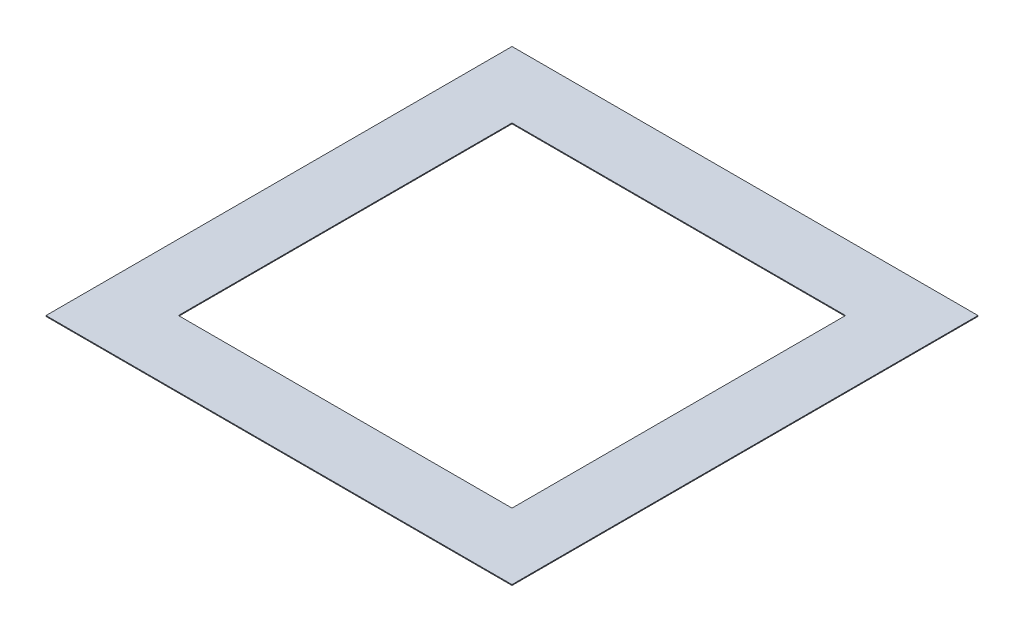
ISO-10303-21;
HEADER;
FILE_DESCRIPTION(('STEP AP214'),'2;1');
FILE_NAME('part.step','',(''),(''),'','','');
FILE_SCHEMA(('AUTOMOTIVE_DESIGN { 1 0 10303 214 1 1 1 1 }'));
ENDSEC;
DATA;
#1=APPLICATION_CONTEXT('core data for automotive mechanical design processes');
#2=APPLICATION_PROTOCOL_DEFINITION('international standard','automotive_design',2000,#1);
#3=PRODUCT_CONTEXT('',#1,'mechanical');
#4=PRODUCT('Part','Part','',(#3));
#5=PRODUCT_RELATED_PRODUCT_CATEGORY('part','',(#4));
#6=PRODUCT_DEFINITION_FORMATION('','',#4);
#7=PRODUCT_DEFINITION_CONTEXT('part definition',#1,'design');
#8=PRODUCT_DEFINITION('design','',#6,#7);
#9=PRODUCT_DEFINITION_SHAPE('','',#8);
#10=(LENGTH_UNIT() NAMED_UNIT(*) SI_UNIT(.MILLI.,.METRE.));
#11=(NAMED_UNIT(*) PLANE_ANGLE_UNIT() SI_UNIT($,.RADIAN.));
#12=(NAMED_UNIT(*) SI_UNIT($,.STERADIAN.) SOLID_ANGLE_UNIT());
#13=UNCERTAINTY_MEASURE_WITH_UNIT(LENGTH_MEASURE(1.E-05),#10,'distance_accuracy_value','');
#14=(GEOMETRIC_REPRESENTATION_CONTEXT(3) GLOBAL_UNCERTAINTY_ASSIGNED_CONTEXT((#13)) GLOBAL_UNIT_ASSIGNED_CONTEXT((#10,
#11,#12)) REPRESENTATION_CONTEXT('',''));
#15=CARTESIAN_POINT('',(0.,0.,0.));
#16=DIRECTION('',(0.,0.,1.));
#17=DIRECTION('',(1.,0.,0.));
#18=AXIS2_PLACEMENT_3D('',#15,#16,#17);
#19=CARTESIAN_POINT('',(0.,0.125,0.));
#20=DIRECTION('',(0.,-1.,0.));
#21=DIRECTION('',(0.,0.,-1.));
#22=AXIS2_PLACEMENT_3D('',#19,#20,#21);
#23=PLANE('',#22);
#24=DIRECTION('',(0.,0.,-1.));
#25=VECTOR('',#24,1.);
#26=CARTESIAN_POINT('',(69.85,0.125,69.85));
#27=LINE('',#26,#25);
#28=CARTESIAN_POINT('',(69.85,0.125,69.85));
#29=VERTEX_POINT('',#28);
#30=CARTESIAN_POINT('',(69.85,0.125,-69.85));
#31=VERTEX_POINT('',#30);
#32=EDGE_CURVE('E136',#29,#31,#27,.T.);
#33=ORIENTED_EDGE('',*,*,#32,.T.);
#34=DIRECTION('',(-1.,0.,0.));
#35=VECTOR('',#34,1.);
#36=CARTESIAN_POINT('',(-69.85,0.125,-69.85));
#37=LINE('',#36,#35);
#38=CARTESIAN_POINT('',(-69.85,0.125,-69.85));
#39=VERTEX_POINT('',#38);
#40=EDGE_CURVE('E139',#31,#39,#37,.T.);
#41=ORIENTED_EDGE('',*,*,#40,.T.);
#42=DIRECTION('',(0.,0.,1.));
#43=VECTOR('',#42,1.);
#44=CARTESIAN_POINT('',(-69.85,0.125,69.85));
#45=LINE('',#44,#43);
#46=CARTESIAN_POINT('',(-69.85,0.125,69.85));
#47=VERTEX_POINT('',#46);
#48=EDGE_CURVE('E142',#39,#47,#45,.T.);
#49=ORIENTED_EDGE('',*,*,#48,.T.);
#50=DIRECTION('',(1.,0.,0.));
#51=VECTOR('',#50,1.);
#52=CARTESIAN_POINT('',(-69.85,0.125,69.85));
#53=LINE('',#52,#51);
#54=EDGE_CURVE('E144',#47,#29,#53,.T.);
#55=ORIENTED_EDGE('',*,*,#54,.T.);
#56=EDGE_LOOP('',(#33,#41,#49,#55));
#57=FACE_BOUND('',#56,.T.);
#58=DIRECTION('',(0.,0.,-1.));
#59=VECTOR('',#58,1.);
#60=CARTESIAN_POINT('',(49.9999999999998,0.125,50.));
#61=LINE('',#60,#59);
#62=CARTESIAN_POINT('',(49.9999999999998,0.125,50.));
#63=VERTEX_POINT('',#62);
#64=CARTESIAN_POINT('',(49.9999999999998,0.125,-50.));
#65=VERTEX_POINT('',#64);
#66=EDGE_CURVE('E100',#63,#65,#61,.T.);
#67=ORIENTED_EDGE('',*,*,#66,.F.);
#68=DIRECTION('',(1.,0.,0.));
#69=VECTOR('',#68,1.);
#70=CARTESIAN_POINT('',(-49.9999999999998,0.125,50.));
#71=LINE('',#70,#69);
#72=CARTESIAN_POINT('',(-49.9999999999998,0.125,50.));
#73=VERTEX_POINT('',#72);
#74=EDGE_CURVE('E122',#73,#63,#71,.T.);
#75=ORIENTED_EDGE('',*,*,#74,.F.);
#76=DIRECTION('',(0.,0.,1.));
#77=VECTOR('',#76,1.);
#78=CARTESIAN_POINT('',(-49.9999999999998,0.125,50.));
#79=LINE('',#78,#77);
#80=CARTESIAN_POINT('',(-49.9999999999998,0.125,-50.));
#81=VERTEX_POINT('',#80);
#82=EDGE_CURVE('E120',#81,#73,#79,.T.);
#83=ORIENTED_EDGE('',*,*,#82,.F.);
#84=DIRECTION('',(-1.,0.,0.));
#85=VECTOR('',#84,1.);
#86=CARTESIAN_POINT('',(-49.9999999999998,0.125,-50.));
#87=LINE('',#86,#85);
#88=EDGE_CURVE('E108',#65,#81,#87,.T.);
#89=ORIENTED_EDGE('',*,*,#88,.F.);
#90=EDGE_LOOP('',(#67,#75,#83,#89));
#91=FACE_BOUND('',#90,.T.);
#92=ADVANCED_FACE('F35',(#57,#91),#23,.F.);
#93=CARTESIAN_POINT('',(0.,-0.125,0.));
#94=DIRECTION('',(0.,-1.,0.));
#95=DIRECTION('',(0.,0.,-1.));
#96=AXIS2_PLACEMENT_3D('',#93,#94,#95);
#97=PLANE('',#96);
#98=DIRECTION('',(0.,0.,-1.));
#99=VECTOR('',#98,1.);
#100=CARTESIAN_POINT('',(69.85,-0.125,69.85));
#101=LINE('',#100,#99);
#102=CARTESIAN_POINT('',(69.85,-0.125,69.85));
#103=VERTEX_POINT('',#102);
#104=CARTESIAN_POINT('',(69.85,-0.125,-69.85));
#105=VERTEX_POINT('',#104);
#106=EDGE_CURVE('E116',#103,#105,#101,.T.);
#107=ORIENTED_EDGE('',*,*,#106,.F.);
#108=DIRECTION('',(1.,0.,0.));
#109=VECTOR('',#108,1.);
#110=CARTESIAN_POINT('',(-69.85,-0.125,69.85));
#111=LINE('',#110,#109);
#112=CARTESIAN_POINT('',(-69.85,-0.125,69.85));
#113=VERTEX_POINT('',#112);
#114=EDGE_CURVE('E140',#113,#103,#111,.T.);
#115=ORIENTED_EDGE('',*,*,#114,.F.);
#116=DIRECTION('',(0.,0.,1.));
#117=VECTOR('',#116,1.);
#118=CARTESIAN_POINT('',(-69.85,-0.125,69.85));
#119=LINE('',#118,#117);
#120=CARTESIAN_POINT('',(-69.85,-0.125,-69.85));
#121=VERTEX_POINT('',#120);
#122=EDGE_CURVE('E151',#121,#113,#119,.T.);
#123=ORIENTED_EDGE('',*,*,#122,.F.);
#124=DIRECTION('',(-1.,0.,0.));
#125=VECTOR('',#124,1.);
#126=CARTESIAN_POINT('',(-69.85,-0.125,-69.85));
#127=LINE('',#126,#125);
#128=EDGE_CURVE('E149',#105,#121,#127,.T.);
#129=ORIENTED_EDGE('',*,*,#128,.F.);
#130=EDGE_LOOP('',(#107,#115,#123,#129));
#131=FACE_BOUND('',#130,.T.);
#132=DIRECTION('',(1.,0.,0.));
#133=VECTOR('',#132,1.);
#134=CARTESIAN_POINT('',(-49.9999999999998,-0.125,50.));
#135=LINE('',#134,#133);
#136=CARTESIAN_POINT('',(-49.9999999999998,-0.125,50.));
#137=VERTEX_POINT('',#136);
#138=CARTESIAN_POINT('',(49.9999999999998,-0.125,50.));
#139=VERTEX_POINT('',#138);
#140=EDGE_CURVE('E109',#137,#139,#135,.T.);
#141=ORIENTED_EDGE('',*,*,#140,.T.);
#142=DIRECTION('',(0.,0.,-1.));
#143=VECTOR('',#142,1.);
#144=CARTESIAN_POINT('',(49.9999999999998,-0.125,50.));
#145=LINE('',#144,#143);
#146=CARTESIAN_POINT('',(49.9999999999998,-0.125,-50.));
#147=VERTEX_POINT('',#146);
#148=EDGE_CURVE('E58',#139,#147,#145,.T.);
#149=ORIENTED_EDGE('',*,*,#148,.T.);
#150=DIRECTION('',(-1.,0.,0.));
#151=VECTOR('',#150,1.);
#152=CARTESIAN_POINT('',(-49.9999999999998,-0.125,-50.));
#153=LINE('',#152,#151);
#154=CARTESIAN_POINT('',(-49.9999999999998,-0.125,-50.));
#155=VERTEX_POINT('',#154);
#156=EDGE_CURVE('E115',#147,#155,#153,.T.);
#157=ORIENTED_EDGE('',*,*,#156,.T.);
#158=DIRECTION('',(0.,0.,1.));
#159=VECTOR('',#158,1.);
#160=CARTESIAN_POINT('',(-49.9999999999998,-0.125,50.));
#161=LINE('',#160,#159);
#162=EDGE_CURVE('E128',#155,#137,#161,.T.);
#163=ORIENTED_EDGE('',*,*,#162,.T.);
#164=EDGE_LOOP('',(#141,#149,#157,#163));
#165=FACE_BOUND('',#164,.T.);
#166=ADVANCED_FACE('F169',(#131,#165),#97,.T.);
#167=CARTESIAN_POINT('',(69.85,0.125,69.85));
#168=DIRECTION('',(-1.,0.,0.));
#169=DIRECTION('',(0.,0.,1.));
#170=AXIS2_PLACEMENT_3D('',#167,#168,#169);
#171=PLANE('',#170);
#172=ORIENTED_EDGE('',*,*,#106,.T.);
#173=DIRECTION('',(0.,-1.,0.));
#174=VECTOR('',#173,1.);
#175=CARTESIAN_POINT('',(69.85,0.125,-69.85));
#176=LINE('',#175,#174);
#177=EDGE_CURVE('E11',#31,#105,#176,.T.);
#178=ORIENTED_EDGE('',*,*,#177,.F.);
#179=ORIENTED_EDGE('',*,*,#32,.F.);
#180=DIRECTION('',(0.,-1.,0.));
#181=VECTOR('',#180,1.);
#182=CARTESIAN_POINT('',(69.85,0.125,69.85));
#183=LINE('',#182,#181);
#184=EDGE_CURVE('E146',#29,#103,#183,.T.);
#185=ORIENTED_EDGE('',*,*,#184,.T.);
#186=EDGE_LOOP('',(#172,#178,#179,#185));
#187=FACE_BOUND('',#186,.T.);
#188=ADVANCED_FACE('F37',(#187),#171,.F.);
#189=CARTESIAN_POINT('',(-69.85,0.125,-69.85));
#190=DIRECTION('',(0.,0.,1.));
#191=DIRECTION('',(1.,0.,0.));
#192=AXIS2_PLACEMENT_3D('',#189,#190,#191);
#193=PLANE('',#192);
#194=ORIENTED_EDGE('',*,*,#128,.T.);
#195=DIRECTION('',(0.,-1.,0.));
#196=VECTOR('',#195,1.);
#197=CARTESIAN_POINT('',(-69.85,0.125,-69.85));
#198=LINE('',#197,#196);
#199=EDGE_CURVE('E43',#39,#121,#198,.T.);
#200=ORIENTED_EDGE('',*,*,#199,.F.);
#201=ORIENTED_EDGE('',*,*,#40,.F.);
#202=ORIENTED_EDGE('',*,*,#177,.T.);
#203=EDGE_LOOP('',(#194,#200,#201,#202));
#204=FACE_BOUND('',#203,.T.);
#205=ADVANCED_FACE('F179',(#204),#193,.F.);
#206=CARTESIAN_POINT('',(-69.85,0.125,69.85));
#207=DIRECTION('',(1.,0.,0.));
#208=DIRECTION('',(0.,0.,-1.));
#209=AXIS2_PLACEMENT_3D('',#206,#207,#208);
#210=PLANE('',#209);
#211=ORIENTED_EDGE('',*,*,#122,.T.);
#212=DIRECTION('',(0.,-1.,0.));
#213=VECTOR('',#212,1.);
#214=CARTESIAN_POINT('',(-69.85,0.125,69.85));
#215=LINE('',#214,#213);
#216=EDGE_CURVE('E156',#47,#113,#215,.T.);
#217=ORIENTED_EDGE('',*,*,#216,.F.);
#218=ORIENTED_EDGE('',*,*,#48,.F.);
#219=ORIENTED_EDGE('',*,*,#199,.T.);
#220=EDGE_LOOP('',(#211,#217,#218,#219));
#221=FACE_BOUND('',#220,.T.);
#222=ADVANCED_FACE('F163',(#221),#210,.F.);
#223=CARTESIAN_POINT('',(-69.85,0.125,69.85));
#224=DIRECTION('',(0.,0.,-1.));
#225=DIRECTION('',(-1.,0.,0.));
#226=AXIS2_PLACEMENT_3D('',#223,#224,#225);
#227=PLANE('',#226);
#228=ORIENTED_EDGE('',*,*,#114,.T.);
#229=ORIENTED_EDGE('',*,*,#184,.F.);
#230=ORIENTED_EDGE('',*,*,#54,.F.);
#231=ORIENTED_EDGE('',*,*,#216,.T.);
#232=EDGE_LOOP('',(#228,#229,#230,#231));
#233=FACE_BOUND('',#232,.T.);
#234=ADVANCED_FACE('F173',(#233),#227,.F.);
#235=CARTESIAN_POINT('',(49.9999999999998,0.125,50.));
#236=DIRECTION('',(-1.,0.,0.));
#237=DIRECTION('',(0.,0.,1.));
#238=AXIS2_PLACEMENT_3D('',#235,#236,#237);
#239=PLANE('',#238);
#240=ORIENTED_EDGE('',*,*,#148,.F.);
#241=DIRECTION('',(0.,-1.,0.));
#242=VECTOR('',#241,1.);
#243=CARTESIAN_POINT('',(49.9999999999998,0.125,50.));
#244=LINE('',#243,#242);
#245=EDGE_CURVE('E104',#63,#139,#244,.T.);
#246=ORIENTED_EDGE('',*,*,#245,.F.);
#247=ORIENTED_EDGE('',*,*,#66,.T.);
#248=DIRECTION('',(0.,-1.,0.));
#249=VECTOR('',#248,1.);
#250=CARTESIAN_POINT('',(49.9999999999998,0.125,-50.));
#251=LINE('',#250,#249);
#252=EDGE_CURVE('E103',#65,#147,#251,.T.);
#253=ORIENTED_EDGE('',*,*,#252,.T.);
#254=EDGE_LOOP('',(#240,#246,#247,#253));
#255=FACE_BOUND('',#254,.T.);
#256=ADVANCED_FACE('F102',(#255),#239,.T.);
#257=CARTESIAN_POINT('',(-49.9999999999998,0.125,-50.));
#258=DIRECTION('',(0.,0.,1.));
#259=DIRECTION('',(1.,0.,0.));
#260=AXIS2_PLACEMENT_3D('',#257,#258,#259);
#261=PLANE('',#260);
#262=ORIENTED_EDGE('',*,*,#156,.F.);
#263=ORIENTED_EDGE('',*,*,#252,.F.);
#264=ORIENTED_EDGE('',*,*,#88,.T.);
#265=DIRECTION('',(0.,-1.,0.));
#266=VECTOR('',#265,1.);
#267=CARTESIAN_POINT('',(-49.9999999999998,0.125,-50.));
#268=LINE('',#267,#266);
#269=EDGE_CURVE('E117',#81,#155,#268,.T.);
#270=ORIENTED_EDGE('',*,*,#269,.T.);
#271=EDGE_LOOP('',(#262,#263,#264,#270));
#272=FACE_BOUND('',#271,.T.);
#273=ADVANCED_FACE('F112',(#272),#261,.T.);
#274=CARTESIAN_POINT('',(-49.9999999999998,0.125,50.));
#275=DIRECTION('',(1.,0.,0.));
#276=DIRECTION('',(0.,0.,-1.));
#277=AXIS2_PLACEMENT_3D('',#274,#275,#276);
#278=PLANE('',#277);
#279=ORIENTED_EDGE('',*,*,#162,.F.);
#280=ORIENTED_EDGE('',*,*,#269,.F.);
#281=ORIENTED_EDGE('',*,*,#82,.T.);
#282=DIRECTION('',(0.,-1.,0.));
#283=VECTOR('',#282,1.);
#284=CARTESIAN_POINT('',(-49.9999999999998,0.125,50.));
#285=LINE('',#284,#283);
#286=EDGE_CURVE('E50',#73,#137,#285,.T.);
#287=ORIENTED_EDGE('',*,*,#286,.T.);
#288=EDGE_LOOP('',(#279,#280,#281,#287));
#289=FACE_BOUND('',#288,.T.);
#290=ADVANCED_FACE('F202',(#289),#278,.T.);
#291=CARTESIAN_POINT('',(-49.9999999999998,0.125,50.));
#292=DIRECTION('',(0.,0.,-1.));
#293=DIRECTION('',(-1.,0.,0.));
#294=AXIS2_PLACEMENT_3D('',#291,#292,#293);
#295=PLANE('',#294);
#296=ORIENTED_EDGE('',*,*,#140,.F.);
#297=ORIENTED_EDGE('',*,*,#286,.F.);
#298=ORIENTED_EDGE('',*,*,#74,.T.);
#299=ORIENTED_EDGE('',*,*,#245,.T.);
#300=EDGE_LOOP('',(#296,#297,#298,#299));
#301=FACE_BOUND('',#300,.T.);
#302=ADVANCED_FACE('F206',(#301),#295,.T.);
#303=CLOSED_SHELL('',(#92,#166,#188,#205,#222,#234,#256,#273,#290,#302));
#304=MANIFOLD_SOLID_BREP('B2',#303);
#305=ADVANCED_BREP_SHAPE_REPRESENTATION('',(#18,#304),#14);
#306=SHAPE_DEFINITION_REPRESENTATION(#9,#305);
ENDSEC;
END-ISO-10303-21;
